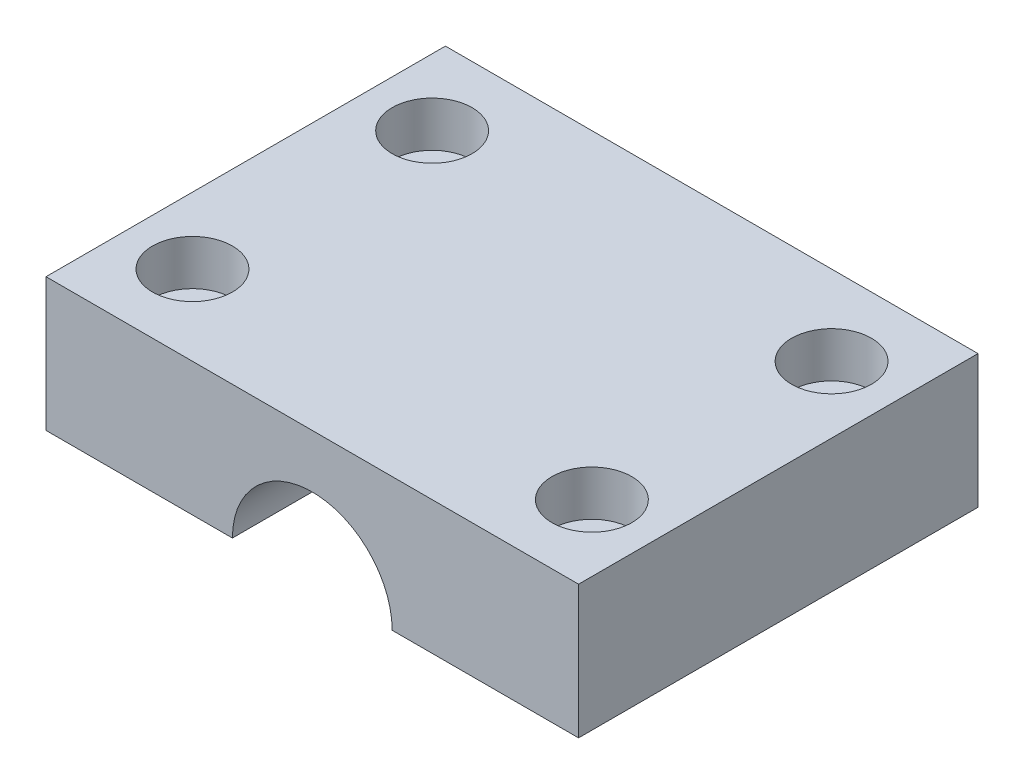
ISO-10303-21;
HEADER;
FILE_DESCRIPTION(('STEP AP214'),'2;1');
FILE_NAME('part.step','',(''),(''),'','','');
FILE_SCHEMA(('AUTOMOTIVE_DESIGN { 1 0 10303 214 1 1 1 1 }'));
ENDSEC;
DATA;
#1=APPLICATION_CONTEXT('core data for automotive mechanical design processes');
#2=APPLICATION_PROTOCOL_DEFINITION('international standard','automotive_design',2000,#1);
#3=PRODUCT_CONTEXT('',#1,'mechanical');
#4=PRODUCT('Part','Part','',(#3));
#5=PRODUCT_RELATED_PRODUCT_CATEGORY('part','',(#4));
#6=PRODUCT_DEFINITION_FORMATION('','',#4);
#7=PRODUCT_DEFINITION_CONTEXT('part definition',#1,'design');
#8=PRODUCT_DEFINITION('design','',#6,#7);
#9=PRODUCT_DEFINITION_SHAPE('','',#8);
#10=(LENGTH_UNIT() NAMED_UNIT(*) SI_UNIT(.MILLI.,.METRE.));
#11=(NAMED_UNIT(*) PLANE_ANGLE_UNIT() SI_UNIT($,.RADIAN.));
#12=(NAMED_UNIT(*) SI_UNIT($,.STERADIAN.) SOLID_ANGLE_UNIT());
#13=UNCERTAINTY_MEASURE_WITH_UNIT(LENGTH_MEASURE(1.E-05),#10,'distance_accuracy_value','');
#14=(GEOMETRIC_REPRESENTATION_CONTEXT(3) GLOBAL_UNCERTAINTY_ASSIGNED_CONTEXT((#13)) GLOBAL_UNIT_ASSIGNED_CONTEXT((#10,
#11,#12)) REPRESENTATION_CONTEXT('',''));
#15=CARTESIAN_POINT('',(0.,0.,0.));
#16=DIRECTION('',(0.,0.,1.));
#17=DIRECTION('',(1.,0.,0.));
#18=AXIS2_PLACEMENT_3D('',#15,#16,#17);
#19=CARTESIAN_POINT('',(0.,0.,0.));
#20=DIRECTION('',(0.,-1.,0.));
#21=DIRECTION('',(0.,0.,1.));
#22=AXIS2_PLACEMENT_3D('',#19,#20,#21);
#23=PLANE('',#22);
#24=CARTESIAN_POINT('',(35.,0.,24.));
#25=DIRECTION('',(0.,-1.,0.));
#26=DIRECTION('',(0.,0.,-1.));
#27=AXIS2_PLACEMENT_3D('',#24,#25,#26);
#28=CIRCLE('',#27,1.6);
#29=CARTESIAN_POINT('',(35.,0.,22.4));
#30=VERTEX_POINT('',#29);
#31=EDGE_CURVE('E189',#30,#30,#28,.T.);
#32=ORIENTED_EDGE('',*,*,#31,.F.);
#33=EDGE_LOOP('',(#32));
#34=FACE_BOUND('',#33,.T.);
#35=CARTESIAN_POINT('',(35.0000000000001,0.,6.));
#36=DIRECTION('',(0.,-1.,0.));
#37=DIRECTION('',(0.,0.,-1.));
#38=AXIS2_PLACEMENT_3D('',#35,#36,#37);
#39=CIRCLE('',#38,1.6);
#40=CARTESIAN_POINT('',(35.0000000000001,0.,4.4));
#41=VERTEX_POINT('',#40);
#42=EDGE_CURVE('E152',#41,#41,#39,.T.);
#43=ORIENTED_EDGE('',*,*,#42,.F.);
#44=EDGE_LOOP('',(#43));
#45=FACE_BOUND('',#44,.T.);
#46=DIRECTION('',(0.,0.,-1.));
#47=VECTOR('',#46,1.);
#48=CARTESIAN_POINT('',(26.,0.,30.));
#49=LINE('',#48,#47);
#50=CARTESIAN_POINT('',(26.,0.,30.));
#51=VERTEX_POINT('',#50);
#52=CARTESIAN_POINT('',(26.,0.,0.));
#53=VERTEX_POINT('',#52);
#54=EDGE_CURVE('E107',#51,#53,#49,.T.);
#55=ORIENTED_EDGE('',*,*,#54,.T.);
#56=DIRECTION('',(1.,0.,0.));
#57=VECTOR('',#56,1.);
#58=CARTESIAN_POINT('',(0.,0.,0.));
#59=LINE('',#58,#57);
#60=CARTESIAN_POINT('',(40.,0.,0.));
#61=VERTEX_POINT('',#60);
#62=EDGE_CURVE('E137',#53,#61,#59,.T.);
#63=ORIENTED_EDGE('',*,*,#62,.T.);
#64=DIRECTION('',(0.,0.,1.));
#65=VECTOR('',#64,1.);
#66=CARTESIAN_POINT('',(40.,0.,0.));
#67=LINE('',#66,#65);
#68=CARTESIAN_POINT('',(40.,0.,30.));
#69=VERTEX_POINT('',#68);
#70=EDGE_CURVE('E122',#61,#69,#67,.T.);
#71=ORIENTED_EDGE('',*,*,#70,.T.);
#72=DIRECTION('',(-1.,0.,0.));
#73=VECTOR('',#72,1.);
#74=CARTESIAN_POINT('',(0.,0.,30.));
#75=LINE('',#74,#73);
#76=EDGE_CURVE('E121',#69,#51,#75,.T.);
#77=ORIENTED_EDGE('',*,*,#76,.T.);
#78=EDGE_LOOP('',(#55,#63,#71,#77));
#79=FACE_BOUND('',#78,.T.);
#80=ADVANCED_FACE('F45',(#34,#45,#79),#23,.T.);
#81=CARTESIAN_POINT('',(0.,10.,0.));
#82=DIRECTION('',(1.,0.,0.));
#83=DIRECTION('',(0.,0.,1.));
#84=AXIS2_PLACEMENT_3D('',#81,#82,#83);
#85=PLANE('',#84);
#86=DIRECTION('',(0.,0.,-1.));
#87=VECTOR('',#86,1.);
#88=CARTESIAN_POINT('',(0.,0.,0.));
#89=LINE('',#88,#87);
#90=CARTESIAN_POINT('',(0.,0.,30.));
#91=VERTEX_POINT('',#90);
#92=CARTESIAN_POINT('',(0.,0.,0.));
#93=VERTEX_POINT('',#92);
#94=EDGE_CURVE('E142',#91,#93,#89,.T.);
#95=ORIENTED_EDGE('',*,*,#94,.F.);
#96=DIRECTION('',(0.,-1.,0.));
#97=VECTOR('',#96,1.);
#98=CARTESIAN_POINT('',(0.,10.,30.));
#99=LINE('',#98,#97);
#100=CARTESIAN_POINT('',(0.,10.,30.));
#101=VERTEX_POINT('',#100);
#102=EDGE_CURVE('E119',#101,#91,#99,.T.);
#103=ORIENTED_EDGE('',*,*,#102,.F.);
#104=DIRECTION('',(0.,0.,-1.));
#105=VECTOR('',#104,1.);
#106=CARTESIAN_POINT('',(0.,10.,0.));
#107=LINE('',#106,#105);
#108=CARTESIAN_POINT('',(0.,10.,0.));
#109=VERTEX_POINT('',#108);
#110=EDGE_CURVE('E124',#101,#109,#107,.T.);
#111=ORIENTED_EDGE('',*,*,#110,.T.);
#112=DIRECTION('',(0.,-1.,0.));
#113=VECTOR('',#112,1.);
#114=CARTESIAN_POINT('',(0.,10.,0.));
#115=LINE('',#114,#113);
#116=EDGE_CURVE('E11',#109,#93,#115,.T.);
#117=ORIENTED_EDGE('',*,*,#116,.T.);
#118=EDGE_LOOP('',(#95,#103,#111,#117));
#119=FACE_BOUND('',#118,.T.);
#120=ADVANCED_FACE('F47',(#119),#85,.F.);
#121=CARTESIAN_POINT('',(0.,10.,0.));
#122=DIRECTION('',(0.,0.,1.));
#123=DIRECTION('',(-1.,0.,0.));
#124=AXIS2_PLACEMENT_3D('',#121,#122,#123);
#125=PLANE('',#124);
#126=CARTESIAN_POINT('',(14.,0.,0.));
#127=VERTEX_POINT('',#126);
#128=EDGE_CURVE('E106',#93,#127,#59,.T.);
#129=ORIENTED_EDGE('',*,*,#128,.F.);
#130=ORIENTED_EDGE('',*,*,#116,.F.);
#131=DIRECTION('',(1.,0.,0.));
#132=VECTOR('',#131,1.);
#133=CARTESIAN_POINT('',(0.,10.,0.));
#134=LINE('',#133,#132);
#135=CARTESIAN_POINT('',(40.,10.,0.));
#136=VERTEX_POINT('',#135);
#137=EDGE_CURVE('E96',#109,#136,#134,.T.);
#138=ORIENTED_EDGE('',*,*,#137,.T.);
#139=DIRECTION('',(0.,-1.,0.));
#140=VECTOR('',#139,1.);
#141=CARTESIAN_POINT('',(40.,10.,0.));
#142=LINE('',#141,#140);
#143=EDGE_CURVE('E53',#136,#61,#142,.T.);
#144=ORIENTED_EDGE('',*,*,#143,.T.);
#145=ORIENTED_EDGE('',*,*,#62,.F.);
#146=CARTESIAN_POINT('',(20.,0.,0.));
#147=DIRECTION('',(0.,0.,1.));
#148=DIRECTION('',(-1.,0.,0.));
#149=AXIS2_PLACEMENT_3D('',#146,#147,#148);
#150=CIRCLE('',#149,6.);
#151=EDGE_CURVE('E115',#53,#127,#150,.T.);
#152=ORIENTED_EDGE('',*,*,#151,.T.);
#153=EDGE_LOOP('',(#129,#130,#138,#144,#145,#152));
#154=FACE_BOUND('',#153,.T.);
#155=ADVANCED_FACE('F135',(#154),#125,.F.);
#156=CARTESIAN_POINT('',(40.,10.,0.));
#157=DIRECTION('',(-1.,0.,0.));
#158=DIRECTION('',(0.,0.,-1.));
#159=AXIS2_PLACEMENT_3D('',#156,#157,#158);
#160=PLANE('',#159);
#161=ORIENTED_EDGE('',*,*,#70,.F.);
#162=ORIENTED_EDGE('',*,*,#143,.F.);
#163=DIRECTION('',(0.,0.,1.));
#164=VECTOR('',#163,1.);
#165=CARTESIAN_POINT('',(40.,10.,0.));
#166=LINE('',#165,#164);
#167=CARTESIAN_POINT('',(40.,10.,30.));
#168=VERTEX_POINT('',#167);
#169=EDGE_CURVE('E146',#136,#168,#166,.T.);
#170=ORIENTED_EDGE('',*,*,#169,.T.);
#171=DIRECTION('',(0.,-1.,0.));
#172=VECTOR('',#171,1.);
#173=CARTESIAN_POINT('',(40.,10.,30.));
#174=LINE('',#173,#172);
#175=EDGE_CURVE('E130',#168,#69,#174,.T.);
#176=ORIENTED_EDGE('',*,*,#175,.T.);
#177=EDGE_LOOP('',(#161,#162,#170,#176));
#178=FACE_BOUND('',#177,.T.);
#179=ADVANCED_FACE('F140',(#178),#160,.F.);
#180=CARTESIAN_POINT('',(0.,10.,30.));
#181=DIRECTION('',(0.,0.,-1.));
#182=DIRECTION('',(1.,0.,0.));
#183=AXIS2_PLACEMENT_3D('',#180,#181,#182);
#184=PLANE('',#183);
#185=ORIENTED_EDGE('',*,*,#76,.F.);
#186=ORIENTED_EDGE('',*,*,#175,.F.);
#187=DIRECTION('',(-1.,0.,0.));
#188=VECTOR('',#187,1.);
#189=CARTESIAN_POINT('',(0.,10.,30.));
#190=LINE('',#189,#188);
#191=EDGE_CURVE('E69',#168,#101,#190,.T.);
#192=ORIENTED_EDGE('',*,*,#191,.T.);
#193=ORIENTED_EDGE('',*,*,#102,.T.);
#194=CARTESIAN_POINT('',(14.,0.,30.));
#195=VERTEX_POINT('',#194);
#196=EDGE_CURVE('E90',#195,#91,#75,.T.);
#197=ORIENTED_EDGE('',*,*,#196,.F.);
#198=CARTESIAN_POINT('',(20.,0.,30.));
#199=DIRECTION('',(0.,0.,1.));
#200=DIRECTION('',(-1.,0.,0.));
#201=AXIS2_PLACEMENT_3D('',#198,#199,#200);
#202=CIRCLE('',#201,6.);
#203=EDGE_CURVE('E108',#51,#195,#202,.T.);
#204=ORIENTED_EDGE('',*,*,#203,.F.);
#205=EDGE_LOOP('',(#185,#186,#192,#193,#197,#204));
#206=FACE_BOUND('',#205,.T.);
#207=ADVANCED_FACE('F117',(#206),#184,.F.);
#208=CARTESIAN_POINT('',(0.,10.,0.));
#209=DIRECTION('',(0.,-1.,0.));
#210=DIRECTION('',(0.,0.,1.));
#211=AXIS2_PLACEMENT_3D('',#208,#209,#210);
#212=PLANE('',#211);
#213=CARTESIAN_POINT('',(35.,10.,24.));
#214=DIRECTION('',(0.,-1.,0.));
#215=DIRECTION('',(0.,0.,-1.));
#216=AXIS2_PLACEMENT_3D('',#213,#214,#215);
#217=CIRCLE('',#216,3.);
#218=CARTESIAN_POINT('',(35.,10.,21.));
#219=VERTEX_POINT('',#218);
#220=EDGE_CURVE('E198',#219,#219,#217,.T.);
#221=ORIENTED_EDGE('',*,*,#220,.T.);
#222=EDGE_LOOP('',(#221));
#223=FACE_BOUND('',#222,.T.);
#224=CARTESIAN_POINT('',(5.,10.,24.));
#225=DIRECTION('',(0.,-1.,0.));
#226=DIRECTION('',(0.,0.,-1.));
#227=AXIS2_PLACEMENT_3D('',#224,#225,#226);
#228=CIRCLE('',#227,3.);
#229=CARTESIAN_POINT('',(5.,10.,21.));
#230=VERTEX_POINT('',#229);
#231=EDGE_CURVE('E186',#230,#230,#228,.T.);
#232=ORIENTED_EDGE('',*,*,#231,.T.);
#233=EDGE_LOOP('',(#232));
#234=FACE_BOUND('',#233,.T.);
#235=CARTESIAN_POINT('',(5.00000000000007,10.,6.));
#236=DIRECTION('',(0.,-1.,0.));
#237=DIRECTION('',(0.,0.,-1.));
#238=AXIS2_PLACEMENT_3D('',#235,#236,#237);
#239=CIRCLE('',#238,3.);
#240=CARTESIAN_POINT('',(5.00000000000007,10.,3.00000000000001));
#241=VERTEX_POINT('',#240);
#242=EDGE_CURVE('E174',#241,#241,#239,.T.);
#243=ORIENTED_EDGE('',*,*,#242,.T.);
#244=EDGE_LOOP('',(#243));
#245=FACE_BOUND('',#244,.T.);
#246=CARTESIAN_POINT('',(35.0000000000001,10.,6.));
#247=DIRECTION('',(0.,-1.,0.));
#248=DIRECTION('',(0.,0.,-1.));
#249=AXIS2_PLACEMENT_3D('',#246,#247,#248);
#250=CIRCLE('',#249,3.);
#251=CARTESIAN_POINT('',(35.0000000000001,10.,3.00000000000001));
#252=VERTEX_POINT('',#251);
#253=EDGE_CURVE('E162',#252,#252,#250,.T.);
#254=ORIENTED_EDGE('',*,*,#253,.T.);
#255=EDGE_LOOP('',(#254));
#256=FACE_BOUND('',#255,.T.);
#257=ORIENTED_EDGE('',*,*,#110,.F.);
#258=ORIENTED_EDGE('',*,*,#191,.F.);
#259=ORIENTED_EDGE('',*,*,#169,.F.);
#260=ORIENTED_EDGE('',*,*,#137,.F.);
#261=EDGE_LOOP('',(#257,#258,#259,#260));
#262=FACE_BOUND('',#261,.T.);
#263=ADVANCED_FACE('F202',(#223,#234,#245,#256,#262),#212,.F.);
#264=CARTESIAN_POINT('',(5.,0.,24.));
#265=DIRECTION('',(0.,-1.,0.));
#266=DIRECTION('',(0.,0.,-1.));
#267=AXIS2_PLACEMENT_3D('',#264,#265,#266);
#268=CIRCLE('',#267,1.6);
#269=CARTESIAN_POINT('',(5.,0.,22.4));
#270=VERTEX_POINT('',#269);
#271=EDGE_CURVE('E177',#270,#270,#268,.T.);
#272=ORIENTED_EDGE('',*,*,#271,.F.);
#273=EDGE_LOOP('',(#272));
#274=FACE_BOUND('',#273,.T.);
#275=CARTESIAN_POINT('',(5.00000000000007,0.,6.));
#276=DIRECTION('',(0.,-1.,0.));
#277=DIRECTION('',(0.,0.,-1.));
#278=AXIS2_PLACEMENT_3D('',#275,#276,#277);
#279=CIRCLE('',#278,1.6);
#280=CARTESIAN_POINT('',(5.00000000000007,0.,4.4));
#281=VERTEX_POINT('',#280);
#282=EDGE_CURVE('E165',#281,#281,#279,.T.);
#283=ORIENTED_EDGE('',*,*,#282,.F.);
#284=EDGE_LOOP('',(#283));
#285=FACE_BOUND('',#284,.T.);
#286=DIRECTION('',(0.,0.,-1.));
#287=VECTOR('',#286,1.);
#288=CARTESIAN_POINT('',(14.,0.,30.));
#289=LINE('',#288,#287);
#290=EDGE_CURVE('E60',#195,#127,#289,.T.);
#291=ORIENTED_EDGE('',*,*,#290,.F.);
#292=ORIENTED_EDGE('',*,*,#196,.T.);
#293=ORIENTED_EDGE('',*,*,#94,.T.);
#294=ORIENTED_EDGE('',*,*,#128,.T.);
#295=EDGE_LOOP('',(#291,#292,#293,#294));
#296=FACE_BOUND('',#295,.T.);
#297=ADVANCED_FACE('F105',(#274,#285,#296),#23,.T.);
#298=CARTESIAN_POINT('',(20.,0.,30.));
#299=DIRECTION('',(0.,0.,-1.));
#300=DIRECTION('',(1.,0.,0.));
#301=AXIS2_PLACEMENT_3D('',#298,#299,#300);
#302=CYLINDRICAL_SURFACE('',#301,6.);
#303=ORIENTED_EDGE('',*,*,#151,.F.);
#304=ORIENTED_EDGE('',*,*,#54,.F.);
#305=ORIENTED_EDGE('',*,*,#203,.T.);
#306=ORIENTED_EDGE('',*,*,#290,.T.);
#307=EDGE_LOOP('',(#303,#304,#305,#306));
#308=FACE_BOUND('',#307,.T.);
#309=ADVANCED_FACE('F111',(#308),#302,.F.);
#310=CARTESIAN_POINT('',(35.0000000000001,10.,6.));
#311=DIRECTION('',(0.,1.,0.));
#312=DIRECTION('',(0.,0.,-1.));
#313=AXIS2_PLACEMENT_3D('',#310,#311,#312);
#314=CYLINDRICAL_SURFACE('',#313,1.6);
#315=ORIENTED_EDGE('',*,*,#42,.T.);
#316=EDGE_LOOP('',(#315));
#317=FACE_BOUND('',#316,.T.);
#318=CARTESIAN_POINT('',(35.0000000000001,6.6,6.));
#319=DIRECTION('',(0.,-1.,0.));
#320=DIRECTION('',(0.,0.,-1.));
#321=AXIS2_PLACEMENT_3D('',#318,#319,#320);
#322=CIRCLE('',#321,1.60000000000001);
#323=CARTESIAN_POINT('',(35.0000000000001,6.6,4.39999999999999));
#324=VERTEX_POINT('',#323);
#325=EDGE_CURVE('E156',#324,#324,#322,.T.);
#326=ORIENTED_EDGE('',*,*,#325,.F.);
#327=EDGE_LOOP('',(#326));
#328=FACE_BOUND('',#327,.T.);
#329=ADVANCED_FACE('F233',(#317,#328),#314,.F.);
#330=CARTESIAN_POINT('',(36.6000000000001,6.6,6.));
#331=DIRECTION('',(0.,-1.,0.));
#332=DIRECTION('',(0.,0.,1.));
#333=AXIS2_PLACEMENT_3D('',#330,#331,#332);
#334=PLANE('',#333);
#335=ORIENTED_EDGE('',*,*,#325,.T.);
#336=EDGE_LOOP('',(#335));
#337=FACE_BOUND('',#336,.T.);
#338=CARTESIAN_POINT('',(35.0000000000001,6.6,6.));
#339=DIRECTION('',(0.,-1.,0.));
#340=DIRECTION('',(0.,0.,-1.));
#341=AXIS2_PLACEMENT_3D('',#338,#339,#340);
#342=CIRCLE('',#341,3.);
#343=CARTESIAN_POINT('',(35.0000000000001,6.6,3.00000000000001));
#344=VERTEX_POINT('',#343);
#345=EDGE_CURVE('E159',#344,#344,#342,.T.);
#346=ORIENTED_EDGE('',*,*,#345,.F.);
#347=EDGE_LOOP('',(#346));
#348=FACE_BOUND('',#347,.T.);
#349=ADVANCED_FACE('F263',(#337,#348),#334,.F.);
#350=CARTESIAN_POINT('',(35.0000000000001,10.,6.));
#351=DIRECTION('',(0.,1.,0.));
#352=DIRECTION('',(0.,0.,-1.));
#353=AXIS2_PLACEMENT_3D('',#350,#351,#352);
#354=CYLINDRICAL_SURFACE('',#353,3.);
#355=ORIENTED_EDGE('',*,*,#345,.T.);
#356=EDGE_LOOP('',(#355));
#357=FACE_BOUND('',#356,.T.);
#358=ORIENTED_EDGE('',*,*,#253,.F.);
#359=EDGE_LOOP('',(#358));
#360=FACE_BOUND('',#359,.T.);
#361=ADVANCED_FACE('F243',(#357,#360),#354,.F.);
#362=CARTESIAN_POINT('',(5.00000000000007,10.,6.));
#363=DIRECTION('',(0.,1.,0.));
#364=DIRECTION('',(0.,0.,-1.));
#365=AXIS2_PLACEMENT_3D('',#362,#363,#364);
#366=CYLINDRICAL_SURFACE('',#365,1.6);
#367=ORIENTED_EDGE('',*,*,#282,.T.);
#368=EDGE_LOOP('',(#367));
#369=FACE_BOUND('',#368,.T.);
#370=CARTESIAN_POINT('',(5.00000000000007,6.6,6.));
#371=DIRECTION('',(0.,-1.,0.));
#372=DIRECTION('',(0.,0.,-1.));
#373=AXIS2_PLACEMENT_3D('',#370,#371,#372);
#374=CIRCLE('',#373,1.60000000000001);
#375=CARTESIAN_POINT('',(5.00000000000007,6.6,4.39999999999999));
#376=VERTEX_POINT('',#375);
#377=EDGE_CURVE('E168',#376,#376,#374,.T.);
#378=ORIENTED_EDGE('',*,*,#377,.F.);
#379=EDGE_LOOP('',(#378));
#380=FACE_BOUND('',#379,.T.);
#381=ADVANCED_FACE('F239',(#369,#380),#366,.F.);
#382=CARTESIAN_POINT('',(6.60000000000008,6.6,6.));
#383=DIRECTION('',(0.,-1.,0.));
#384=DIRECTION('',(0.,0.,1.));
#385=AXIS2_PLACEMENT_3D('',#382,#383,#384);
#386=PLANE('',#385);
#387=ORIENTED_EDGE('',*,*,#377,.T.);
#388=EDGE_LOOP('',(#387));
#389=FACE_BOUND('',#388,.T.);
#390=CARTESIAN_POINT('',(5.00000000000007,6.6,6.));
#391=DIRECTION('',(0.,-1.,0.));
#392=DIRECTION('',(0.,0.,-1.));
#393=AXIS2_PLACEMENT_3D('',#390,#391,#392);
#394=CIRCLE('',#393,3.);
#395=CARTESIAN_POINT('',(5.00000000000007,6.6,3.00000000000001));
#396=VERTEX_POINT('',#395);
#397=EDGE_CURVE('E171',#396,#396,#394,.T.);
#398=ORIENTED_EDGE('',*,*,#397,.F.);
#399=EDGE_LOOP('',(#398));
#400=FACE_BOUND('',#399,.T.);
#401=ADVANCED_FACE('F242',(#389,#400),#386,.F.);
#402=CARTESIAN_POINT('',(5.00000000000007,10.,6.));
#403=DIRECTION('',(0.,1.,0.));
#404=DIRECTION('',(0.,0.,-1.));
#405=AXIS2_PLACEMENT_3D('',#402,#403,#404);
#406=CYLINDRICAL_SURFACE('',#405,3.);
#407=ORIENTED_EDGE('',*,*,#397,.T.);
#408=EDGE_LOOP('',(#407));
#409=FACE_BOUND('',#408,.T.);
#410=ORIENTED_EDGE('',*,*,#242,.F.);
#411=EDGE_LOOP('',(#410));
#412=FACE_BOUND('',#411,.T.);
#413=ADVANCED_FACE('F249',(#409,#412),#406,.F.);
#414=CARTESIAN_POINT('',(5.,10.,24.));
#415=DIRECTION('',(0.,1.,0.));
#416=DIRECTION('',(0.,0.,-1.));
#417=AXIS2_PLACEMENT_3D('',#414,#415,#416);
#418=CYLINDRICAL_SURFACE('',#417,1.6);
#419=ORIENTED_EDGE('',*,*,#271,.T.);
#420=EDGE_LOOP('',(#419));
#421=FACE_BOUND('',#420,.T.);
#422=CARTESIAN_POINT('',(5.,6.6,24.));
#423=DIRECTION('',(0.,-1.,0.));
#424=DIRECTION('',(0.,0.,-1.));
#425=AXIS2_PLACEMENT_3D('',#422,#423,#424);
#426=CIRCLE('',#425,1.60000000000001);
#427=CARTESIAN_POINT('',(5.,6.6,22.4));
#428=VERTEX_POINT('',#427);
#429=EDGE_CURVE('E180',#428,#428,#426,.T.);
#430=ORIENTED_EDGE('',*,*,#429,.F.);
#431=EDGE_LOOP('',(#430));
#432=FACE_BOUND('',#431,.T.);
#433=ADVANCED_FACE('F255',(#421,#432),#418,.F.);
#434=CARTESIAN_POINT('',(6.60000000000002,6.6,24.));
#435=DIRECTION('',(0.,-1.,0.));
#436=DIRECTION('',(0.,0.,1.));
#437=AXIS2_PLACEMENT_3D('',#434,#435,#436);
#438=PLANE('',#437);
#439=ORIENTED_EDGE('',*,*,#429,.T.);
#440=EDGE_LOOP('',(#439));
#441=FACE_BOUND('',#440,.T.);
#442=CARTESIAN_POINT('',(5.,6.6,24.));
#443=DIRECTION('',(0.,-1.,0.));
#444=DIRECTION('',(0.,0.,-1.));
#445=AXIS2_PLACEMENT_3D('',#442,#443,#444);
#446=CIRCLE('',#445,3.);
#447=CARTESIAN_POINT('',(5.,6.6,21.));
#448=VERTEX_POINT('',#447);
#449=EDGE_CURVE('E183',#448,#448,#446,.T.);
#450=ORIENTED_EDGE('',*,*,#449,.F.);
#451=EDGE_LOOP('',(#450));
#452=FACE_BOUND('',#451,.T.);
#453=ADVANCED_FACE('F325',(#441,#452),#438,.F.);
#454=CARTESIAN_POINT('',(5.,10.,24.));
#455=DIRECTION('',(0.,1.,0.));
#456=DIRECTION('',(0.,0.,-1.));
#457=AXIS2_PLACEMENT_3D('',#454,#455,#456);
#458=CYLINDRICAL_SURFACE('',#457,3.);
#459=ORIENTED_EDGE('',*,*,#449,.T.);
#460=EDGE_LOOP('',(#459));
#461=FACE_BOUND('',#460,.T.);
#462=ORIENTED_EDGE('',*,*,#231,.F.);
#463=EDGE_LOOP('',(#462));
#464=FACE_BOUND('',#463,.T.);
#465=ADVANCED_FACE('F336',(#461,#464),#458,.F.);
#466=CARTESIAN_POINT('',(35.,10.,24.));
#467=DIRECTION('',(0.,1.,0.));
#468=DIRECTION('',(0.,0.,-1.));
#469=AXIS2_PLACEMENT_3D('',#466,#467,#468);
#470=CYLINDRICAL_SURFACE('',#469,1.6);
#471=ORIENTED_EDGE('',*,*,#31,.T.);
#472=EDGE_LOOP('',(#471));
#473=FACE_BOUND('',#472,.T.);
#474=CARTESIAN_POINT('',(35.,6.6,24.));
#475=DIRECTION('',(0.,-1.,0.));
#476=DIRECTION('',(0.,0.,-1.));
#477=AXIS2_PLACEMENT_3D('',#474,#475,#476);
#478=CIRCLE('',#477,1.60000000000001);
#479=CARTESIAN_POINT('',(35.,6.6,22.4));
#480=VERTEX_POINT('',#479);
#481=EDGE_CURVE('E192',#480,#480,#478,.T.);
#482=ORIENTED_EDGE('',*,*,#481,.F.);
#483=EDGE_LOOP('',(#482));
#484=FACE_BOUND('',#483,.T.);
#485=ADVANCED_FACE('F213',(#473,#484),#470,.F.);
#486=CARTESIAN_POINT('',(36.6,6.6,24.));
#487=DIRECTION('',(0.,-1.,0.));
#488=DIRECTION('',(0.,0.,1.));
#489=AXIS2_PLACEMENT_3D('',#486,#487,#488);
#490=PLANE('',#489);
#491=ORIENTED_EDGE('',*,*,#481,.T.);
#492=EDGE_LOOP('',(#491));
#493=FACE_BOUND('',#492,.T.);
#494=CARTESIAN_POINT('',(35.,6.6,24.));
#495=DIRECTION('',(0.,-1.,0.));
#496=DIRECTION('',(0.,0.,-1.));
#497=AXIS2_PLACEMENT_3D('',#494,#495,#496);
#498=CIRCLE('',#497,3.);
#499=CARTESIAN_POINT('',(35.,6.6,21.));
#500=VERTEX_POINT('',#499);
#501=EDGE_CURVE('E195',#500,#500,#498,.T.);
#502=ORIENTED_EDGE('',*,*,#501,.F.);
#503=EDGE_LOOP('',(#502));
#504=FACE_BOUND('',#503,.T.);
#505=ADVANCED_FACE('F207',(#493,#504),#490,.F.);
#506=CARTESIAN_POINT('',(35.,10.,24.));
#507=DIRECTION('',(0.,1.,0.));
#508=DIRECTION('',(0.,0.,-1.));
#509=AXIS2_PLACEMENT_3D('',#506,#507,#508);
#510=CYLINDRICAL_SURFACE('',#509,3.);
#511=ORIENTED_EDGE('',*,*,#501,.T.);
#512=EDGE_LOOP('',(#511));
#513=FACE_BOUND('',#512,.T.);
#514=ORIENTED_EDGE('',*,*,#220,.F.);
#515=EDGE_LOOP('',(#514));
#516=FACE_BOUND('',#515,.T.);
#517=ADVANCED_FACE('F205',(#513,#516),#510,.F.);
#518=CLOSED_SHELL('',(#80,#120,#155,#179,#207,#263,#297,#309,#329,#349,#361,#381,#401,#413,#433,
#453,#465,#485,#505,#517));
#519=MANIFOLD_SOLID_BREP('B2',#518);
#520=ADVANCED_BREP_SHAPE_REPRESENTATION('',(#18,#519),#14);
#521=SHAPE_DEFINITION_REPRESENTATION(#9,#520);
ENDSEC;
END-ISO-10303-21;
